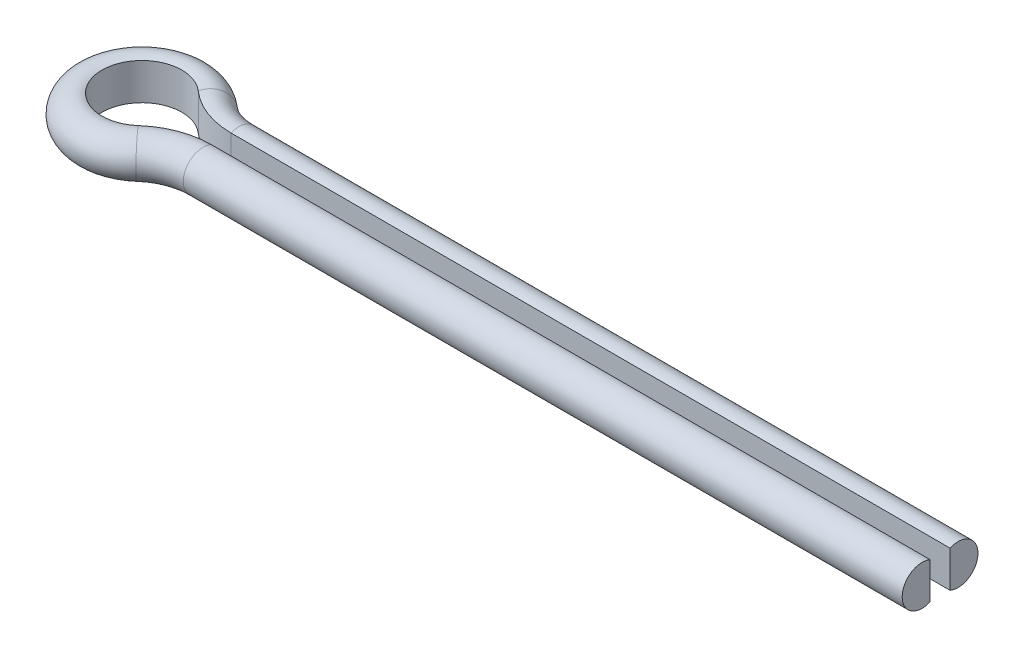
ISO-10303-21;
HEADER;
FILE_DESCRIPTION(('STEP AP214'),'2;1');
FILE_NAME('part.step','',(''),(''),'','','');
FILE_SCHEMA(('AUTOMOTIVE_DESIGN { 1 0 10303 214 1 1 1 1 }'));
ENDSEC;
DATA;
#1=APPLICATION_CONTEXT('core data for automotive mechanical design processes');
#2=APPLICATION_PROTOCOL_DEFINITION('international standard','automotive_design',2000,#1);
#3=PRODUCT_CONTEXT('',#1,'mechanical');
#4=PRODUCT('Part','Part','',(#3));
#5=PRODUCT_RELATED_PRODUCT_CATEGORY('part','',(#4));
#6=PRODUCT_DEFINITION_FORMATION('','',#4);
#7=PRODUCT_DEFINITION_CONTEXT('part definition',#1,'design');
#8=PRODUCT_DEFINITION('design','',#6,#7);
#9=PRODUCT_DEFINITION_SHAPE('','',#8);
#10=(LENGTH_UNIT() NAMED_UNIT(*) SI_UNIT(.MILLI.,.METRE.));
#11=(NAMED_UNIT(*) PLANE_ANGLE_UNIT() SI_UNIT($,.RADIAN.));
#12=(NAMED_UNIT(*) SI_UNIT($,.STERADIAN.) SOLID_ANGLE_UNIT());
#13=UNCERTAINTY_MEASURE_WITH_UNIT(LENGTH_MEASURE(1.E-05),#10,'distance_accuracy_value','');
#14=(GEOMETRIC_REPRESENTATION_CONTEXT(3) GLOBAL_UNCERTAINTY_ASSIGNED_CONTEXT((#13)) GLOBAL_UNIT_ASSIGNED_CONTEXT((#10,
#11,#12)) REPRESENTATION_CONTEXT('',''));
#15=CARTESIAN_POINT('',(0.,0.,0.));
#16=DIRECTION('',(0.,0.,1.));
#17=DIRECTION('',(1.,0.,0.));
#18=AXIS2_PLACEMENT_3D('',#15,#16,#17);
#19=CARTESIAN_POINT('',(0.,0.,-1.));
#20=DIRECTION('',(1.,0.,0.));
#21=DIRECTION('',(0.,0.,-1.));
#22=AXIS2_PLACEMENT_3D('',#19,#20,#21);
#23=PLANE('',#22);
#24=CARTESIAN_POINT('',(0.,0.,-1.));
#25=DIRECTION('',(1.,0.,0.));
#26=DIRECTION('',(0.,0.,-1.));
#27=AXIS2_PLACEMENT_3D('',#24,#25,#26);
#28=CIRCLE('',#27,2.5);
#29=CARTESIAN_POINT('',(0.,-2.29128784747792,0.));
#30=VERTEX_POINT('',#29);
#31=CARTESIAN_POINT('',(0.,2.29128784747792,0.));
#32=VERTEX_POINT('',#31);
#33=EDGE_CURVE('E84',#30,#32,#28,.T.);
#34=ORIENTED_EDGE('',*,*,#33,.T.);
#35=DIRECTION('',(0.,-1.,0.));
#36=VECTOR('',#35,1.);
#37=CARTESIAN_POINT('',(0.,-2.29128784747792,0.));
#38=LINE('',#37,#36);
#39=EDGE_CURVE('E93',#32,#30,#38,.T.);
#40=ORIENTED_EDGE('',*,*,#39,.T.);
#41=EDGE_LOOP('',(#34,#40));
#42=FACE_BOUND('',#41,.T.);
#43=ADVANCED_FACE('F33',(#42),#23,.T.);
#44=CARTESIAN_POINT('',(0.,0.,3.50000000000001));
#45=DIRECTION('',(-1.,0.,0.));
#46=DIRECTION('',(0.,0.,1.));
#47=AXIS2_PLACEMENT_3D('',#44,#45,#46);
#48=PLANE('',#47);
#49=CARTESIAN_POINT('',(0.,0.,3.50000000000001));
#50=DIRECTION('',(-1.,0.,0.));
#51=DIRECTION('',(0.,0.,1.));
#52=AXIS2_PLACEMENT_3D('',#49,#50,#51);
#53=CIRCLE('',#52,2.5);
#54=CARTESIAN_POINT('',(0.,-2.29128784747792,2.50000000000001));
#55=VERTEX_POINT('',#54);
#56=CARTESIAN_POINT('',(0.,2.29128784747792,2.50000000000001));
#57=VERTEX_POINT('',#56);
#58=EDGE_CURVE('E47',#55,#57,#53,.T.);
#59=ORIENTED_EDGE('',*,*,#58,.F.);
#60=DIRECTION('',(0.,-1.,0.));
#61=VECTOR('',#60,1.);
#62=CARTESIAN_POINT('',(0.,-2.29128784747792,2.50000000000001));
#63=LINE('',#62,#61);
#64=EDGE_CURVE('E11',#57,#55,#63,.T.);
#65=ORIENTED_EDGE('',*,*,#64,.F.);
#66=EDGE_LOOP('',(#59,#65));
#67=FACE_BOUND('',#66,.T.);
#68=ADVANCED_FACE('F184',(#67),#48,.F.);
#69=CARTESIAN_POINT('',(0.,0.,-1.));
#70=DIRECTION('',(-1.,0.,0.));
#71=DIRECTION('',(0.,0.,1.));
#72=AXIS2_PLACEMENT_3D('',#69,#70,#71);
#73=CYLINDRICAL_SURFACE('',#72,2.5);
#74=DIRECTION('',(-1.,0.,0.));
#75=VECTOR('',#74,1.);
#76=CARTESIAN_POINT('',(0.,2.29128784747792,0.));
#77=LINE('',#76,#75);
#78=CARTESIAN_POINT('',(-90.0784325835078,2.29128784747792,0.));
#79=VERTEX_POINT('',#78);
#80=EDGE_CURVE('E91',#32,#79,#77,.T.);
#81=ORIENTED_EDGE('',*,*,#80,.F.);
#82=ORIENTED_EDGE('',*,*,#33,.F.);
#83=DIRECTION('',(-1.,0.,0.));
#84=VECTOR('',#83,1.);
#85=CARTESIAN_POINT('',(0.,-2.29128784747792,0.));
#86=LINE('',#85,#84);
#87=CARTESIAN_POINT('',(-90.0784325835078,-2.29128784747792,0.));
#88=VERTEX_POINT('',#87);
#89=EDGE_CURVE('E89',#30,#88,#86,.T.);
#90=ORIENTED_EDGE('',*,*,#89,.T.);
#91=CARTESIAN_POINT('',(-90.0784325835078,0.,-0.999999999999989));
#92=DIRECTION('',(1.,0.,0.));
#93=DIRECTION('',(0.,0.,-1.));
#94=AXIS2_PLACEMENT_3D('',#91,#92,#93);
#95=CIRCLE('',#94,2.5);
#96=EDGE_CURVE('E102',#88,#79,#95,.T.);
#97=ORIENTED_EDGE('',*,*,#96,.T.);
#98=EDGE_LOOP('',(#81,#82,#90,#97));
#99=FACE_BOUND('',#98,.T.);
#100=ADVANCED_FACE('F86',(#99),#73,.T.);
#101=CARTESIAN_POINT('',(0.,-2.29128784747792,0.));
#102=DIRECTION('',(0.,0.,-1.));
#103=DIRECTION('',(0.,1.,0.));
#104=AXIS2_PLACEMENT_3D('',#101,#102,#103);
#105=PLANE('',#104);
#106=DIRECTION('',(0.,-1.,0.));
#107=VECTOR('',#106,1.);
#108=CARTESIAN_POINT('',(-90.0784325835078,-2.29128784747792,0.));
#109=LINE('',#108,#107);
#110=EDGE_CURVE('E100',#79,#88,#109,.T.);
#111=ORIENTED_EDGE('',*,*,#110,.T.);
#112=ORIENTED_EDGE('',*,*,#89,.F.);
#113=ORIENTED_EDGE('',*,*,#39,.F.);
#114=ORIENTED_EDGE('',*,*,#80,.T.);
#115=EDGE_LOOP('',(#111,#112,#113,#114));
#116=FACE_BOUND('',#115,.T.);
#117=ADVANCED_FACE('F98',(#116),#105,.F.);
#118=CARTESIAN_POINT('',(-90.0784325835078,0.,-9.99999999999999));
#119=DIRECTION('',(0.,-1.,0.));
#120=DIRECTION('',(0.,0.,-1.));
#121=AXIS2_PLACEMENT_3D('',#118,#119,#120);
#122=TOROIDAL_SURFACE('',#121,9.,2.5);
#123=CARTESIAN_POINT('',(-90.0784325835078,2.29128784747792,-9.99999999999999));
#124=DIRECTION('',(0.,-1.,0.));
#125=DIRECTION('',(0.,0.,1.));
#126=AXIS2_PLACEMENT_3D('',#123,#124,#125);
#127=CIRCLE('',#126,9.99999999999999);
#128=CARTESIAN_POINT('',(-96.6928108611693,2.29128784747792,-2.49999999999999));
#129=VERTEX_POINT('',#128);
#130=EDGE_CURVE('E110',#79,#129,#127,.T.);
#131=ORIENTED_EDGE('',*,*,#130,.F.);
#132=ORIENTED_EDGE('',*,*,#96,.F.);
#133=CARTESIAN_POINT('',(-90.0784325835078,-2.29128784747792,-9.99999999999999));
#134=DIRECTION('',(0.,-1.,0.));
#135=DIRECTION('',(0.,0.,1.));
#136=AXIS2_PLACEMENT_3D('',#133,#134,#135);
#137=CIRCLE('',#136,10.);
#138=CARTESIAN_POINT('',(-96.6928108611693,-2.29128784747792,-2.49999999999998));
#139=VERTEX_POINT('',#138);
#140=EDGE_CURVE('E111',#88,#139,#137,.T.);
#141=ORIENTED_EDGE('',*,*,#140,.T.);
#142=CARTESIAN_POINT('',(-96.0313730334031,0.,-3.24999999999998));
#143=DIRECTION('',(0.750000000000001,0.,0.661437827766147));
#144=DIRECTION('',(0.661437827766147,0.,-0.750000000000001));
#145=AXIS2_PLACEMENT_3D('',#142,#143,#144);
#146=CIRCLE('',#145,2.5);
#147=EDGE_CURVE('E107',#139,#129,#146,.T.);
#148=ORIENTED_EDGE('',*,*,#147,.T.);
#149=EDGE_LOOP('',(#131,#132,#141,#148));
#150=FACE_BOUND('',#149,.T.);
#151=ADVANCED_FACE('F164',(#150),#122,.T.);
#152=CARTESIAN_POINT('',(-90.0784325835078,0.,-9.99999999999999));
#153=DIRECTION('',(0.,-1.,0.));
#154=DIRECTION('',(0.,0.,-1.));
#155=AXIS2_PLACEMENT_3D('',#152,#153,#154);
#156=CYLINDRICAL_SURFACE('',#155,10.);
#157=DIRECTION('',(0.,-1.,0.));
#158=VECTOR('',#157,1.);
#159=CARTESIAN_POINT('',(-96.6928108611693,-2.29128784747792,-2.49999999999998));
#160=LINE('',#159,#158);
#161=EDGE_CURVE('E114',#129,#139,#160,.T.);
#162=ORIENTED_EDGE('',*,*,#161,.T.);
#163=ORIENTED_EDGE('',*,*,#140,.F.);
#164=ORIENTED_EDGE('',*,*,#110,.F.);
#165=ORIENTED_EDGE('',*,*,#130,.T.);
#166=EDGE_LOOP('',(#162,#163,#164,#165));
#167=FACE_BOUND('',#166,.T.);
#168=ADVANCED_FACE('F162',(#167),#156,.T.);
#169=CARTESIAN_POINT('',(-100.,0.,1.25000000000001));
#170=DIRECTION('',(0.,1.,0.));
#171=DIRECTION('',(0.,0.,1.));
#172=AXIS2_PLACEMENT_3D('',#169,#170,#171);
#173=TOROIDAL_SURFACE('',#172,6.,2.5);
#174=CARTESIAN_POINT('',(-100.,2.29128784747792,1.25000000000001));
#175=DIRECTION('',(0.,1.,0.));
#176=DIRECTION('',(0.661437827766148,0.,-0.75));
#177=AXIS2_PLACEMENT_3D('',#174,#175,#176);
#178=CIRCLE('',#177,5.);
#179=CARTESIAN_POINT('',(-96.6928108611693,2.29128784747792,5.00000000000001));
#180=VERTEX_POINT('',#179);
#181=EDGE_CURVE('E120',#129,#180,#178,.T.);
#182=ORIENTED_EDGE('',*,*,#181,.F.);
#183=ORIENTED_EDGE('',*,*,#147,.F.);
#184=CARTESIAN_POINT('',(-100.,-2.29128784747792,1.25000000000001));
#185=DIRECTION('',(0.,1.,0.));
#186=DIRECTION('',(0.661437827766149,0.,-0.749999999999999));
#187=AXIS2_PLACEMENT_3D('',#184,#185,#186);
#188=CIRCLE('',#187,5.);
#189=CARTESIAN_POINT('',(-96.6928108611693,-2.29128784747792,5.));
#190=VERTEX_POINT('',#189);
#191=EDGE_CURVE('E121',#139,#190,#188,.T.);
#192=ORIENTED_EDGE('',*,*,#191,.T.);
#193=CARTESIAN_POINT('',(-96.0313730334031,0.,5.75000000000001));
#194=DIRECTION('',(-0.75,0.,0.661437827766148));
#195=DIRECTION('',(0.661437827766148,0.,0.75));
#196=AXIS2_PLACEMENT_3D('',#193,#194,#195);
#197=CIRCLE('',#196,2.5);
#198=EDGE_CURVE('E117',#190,#180,#197,.T.);
#199=ORIENTED_EDGE('',*,*,#198,.T.);
#200=EDGE_LOOP('',(#182,#183,#192,#199));
#201=FACE_BOUND('',#200,.T.);
#202=ADVANCED_FACE('F157',(#201),#173,.T.);
#203=CARTESIAN_POINT('',(-100.,0.,1.25000000000001));
#204=DIRECTION('',(0.,1.,0.));
#205=DIRECTION('',(0.,0.,1.));
#206=AXIS2_PLACEMENT_3D('',#203,#204,#205);
#207=CYLINDRICAL_SURFACE('',#206,5.);
#208=DIRECTION('',(0.,-1.,0.));
#209=VECTOR('',#208,1.);
#210=CARTESIAN_POINT('',(-96.6928108611693,-2.29128784747792,5.));
#211=LINE('',#210,#209);
#212=EDGE_CURVE('E124',#180,#190,#211,.T.);
#213=ORIENTED_EDGE('',*,*,#212,.T.);
#214=ORIENTED_EDGE('',*,*,#191,.F.);
#215=ORIENTED_EDGE('',*,*,#161,.F.);
#216=ORIENTED_EDGE('',*,*,#181,.T.);
#217=EDGE_LOOP('',(#213,#214,#215,#216));
#218=FACE_BOUND('',#217,.T.);
#219=ADVANCED_FACE('F160',(#218),#207,.F.);
#220=CARTESIAN_POINT('',(-90.0784325835078,0.,12.5));
#221=DIRECTION('',(0.,-1.,0.));
#222=DIRECTION('',(0.,0.,-1.));
#223=AXIS2_PLACEMENT_3D('',#220,#221,#222);
#224=TOROIDAL_SURFACE('',#223,9.,2.5);
#225=CARTESIAN_POINT('',(-90.0784325835078,2.29128784747792,12.5));
#226=DIRECTION('',(0.,-1.,0.));
#227=DIRECTION('',(-0.661437827766147,0.,-0.750000000000001));
#228=AXIS2_PLACEMENT_3D('',#225,#226,#227);
#229=CIRCLE('',#228,10.);
#230=CARTESIAN_POINT('',(-90.0784325835078,2.29128784747792,2.50000000000002));
#231=VERTEX_POINT('',#230);
#232=EDGE_CURVE('E130',#180,#231,#229,.T.);
#233=ORIENTED_EDGE('',*,*,#232,.F.);
#234=ORIENTED_EDGE('',*,*,#198,.F.);
#235=CARTESIAN_POINT('',(-90.0784325835078,-2.29128784747792,12.5));
#236=DIRECTION('',(0.,-1.,0.));
#237=DIRECTION('',(-0.661437827766147,0.,-0.750000000000001));
#238=AXIS2_PLACEMENT_3D('',#235,#236,#237);
#239=CIRCLE('',#238,10.);
#240=CARTESIAN_POINT('',(-90.0784325835078,-2.29128784747792,2.50000000000001));
#241=VERTEX_POINT('',#240);
#242=EDGE_CURVE('E131',#190,#241,#239,.T.);
#243=ORIENTED_EDGE('',*,*,#242,.T.);
#244=CARTESIAN_POINT('',(-90.0784325835078,0.,3.50000000000002));
#245=DIRECTION('',(-1.,0.,0.));
#246=DIRECTION('',(0.,0.,1.));
#247=AXIS2_PLACEMENT_3D('',#244,#245,#246);
#248=CIRCLE('',#247,2.5);
#249=EDGE_CURVE('E127',#241,#231,#248,.T.);
#250=ORIENTED_EDGE('',*,*,#249,.T.);
#251=EDGE_LOOP('',(#233,#234,#243,#250));
#252=FACE_BOUND('',#251,.T.);
#253=ADVANCED_FACE('F154',(#252),#224,.T.);
#254=CARTESIAN_POINT('',(-90.0784325835078,0.,12.5));
#255=DIRECTION('',(0.,-1.,0.));
#256=DIRECTION('',(0.,0.,-1.));
#257=AXIS2_PLACEMENT_3D('',#254,#255,#256);
#258=CYLINDRICAL_SURFACE('',#257,10.);
#259=DIRECTION('',(0.,-1.,0.));
#260=VECTOR('',#259,1.);
#261=CARTESIAN_POINT('',(-90.0784325835078,-2.29128784747792,2.50000000000001));
#262=LINE('',#261,#260);
#263=EDGE_CURVE('E134',#231,#241,#262,.T.);
#264=ORIENTED_EDGE('',*,*,#263,.T.);
#265=ORIENTED_EDGE('',*,*,#242,.F.);
#266=ORIENTED_EDGE('',*,*,#212,.F.);
#267=ORIENTED_EDGE('',*,*,#232,.T.);
#268=EDGE_LOOP('',(#264,#265,#266,#267));
#269=FACE_BOUND('',#268,.T.);
#270=ADVANCED_FACE('F149',(#269),#258,.T.);
#271=CARTESIAN_POINT('',(-90.0784325835078,0.,3.50000000000001));
#272=DIRECTION('',(1.,0.,0.));
#273=DIRECTION('',(0.,0.,-1.));
#274=AXIS2_PLACEMENT_3D('',#271,#272,#273);
#275=CYLINDRICAL_SURFACE('',#274,2.5);
#276=DIRECTION('',(1.,0.,0.));
#277=VECTOR('',#276,1.);
#278=CARTESIAN_POINT('',(-90.0784325835078,2.29128784747792,2.50000000000002));
#279=LINE('',#278,#277);
#280=EDGE_CURVE('E40',#231,#57,#279,.T.);
#281=ORIENTED_EDGE('',*,*,#280,.F.);
#282=ORIENTED_EDGE('',*,*,#249,.F.);
#283=DIRECTION('',(1.,0.,0.));
#284=VECTOR('',#283,1.);
#285=CARTESIAN_POINT('',(-90.0784325835078,-2.29128784747792,2.50000000000001));
#286=LINE('',#285,#284);
#287=EDGE_CURVE('E138',#241,#55,#286,.T.);
#288=ORIENTED_EDGE('',*,*,#287,.T.);
#289=ORIENTED_EDGE('',*,*,#58,.T.);
#290=EDGE_LOOP('',(#281,#282,#288,#289));
#291=FACE_BOUND('',#290,.T.);
#292=ADVANCED_FACE('F151',(#291),#275,.T.);
#293=CARTESIAN_POINT('',(-90.0784325835078,-2.29128784747792,2.50000000000001));
#294=DIRECTION('',(0.,0.,1.));
#295=DIRECTION('',(0.,-1.,0.));
#296=AXIS2_PLACEMENT_3D('',#293,#294,#295);
#297=PLANE('',#296);
#298=ORIENTED_EDGE('',*,*,#64,.T.);
#299=ORIENTED_EDGE('',*,*,#287,.F.);
#300=ORIENTED_EDGE('',*,*,#263,.F.);
#301=ORIENTED_EDGE('',*,*,#280,.T.);
#302=EDGE_LOOP('',(#298,#299,#300,#301));
#303=FACE_BOUND('',#302,.T.);
#304=ADVANCED_FACE('F175',(#303),#297,.F.);
#305=CLOSED_SHELL('',(#43,#68,#100,#117,#151,#168,#202,#219,#253,#270,#292,#304));
#306=MANIFOLD_SOLID_BREP('B2',#305);
#307=ADVANCED_BREP_SHAPE_REPRESENTATION('',(#18,#306),#14);
#308=SHAPE_DEFINITION_REPRESENTATION(#9,#307);
ENDSEC;
END-ISO-10303-21;
